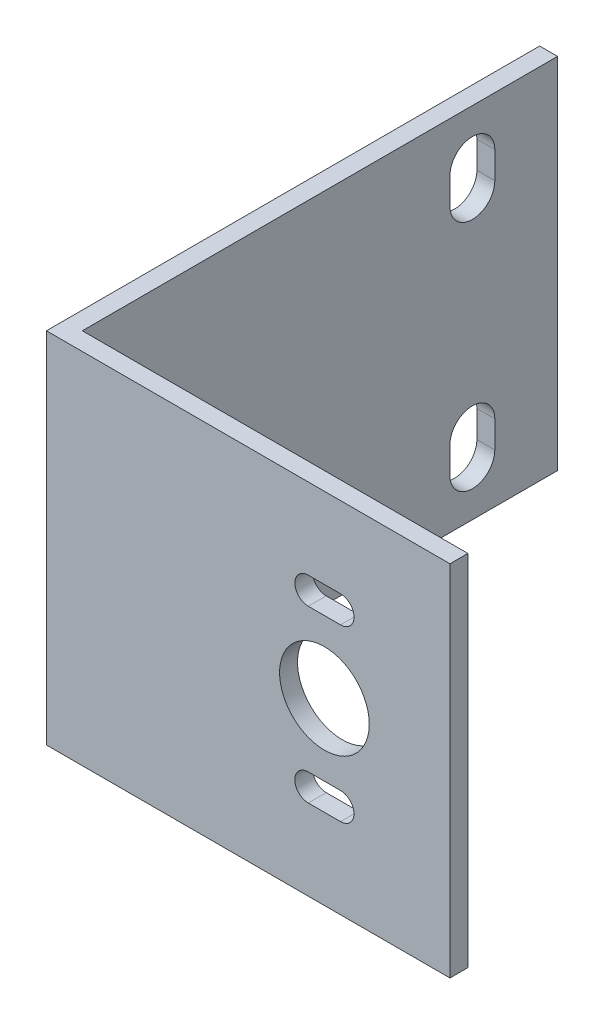
ISO-10303-21;
HEADER;
FILE_DESCRIPTION(('STEP AP214'),'2;1');
FILE_NAME('part.step','',(''),(''),'','','');
FILE_SCHEMA(('AUTOMOTIVE_DESIGN { 1 0 10303 214 1 1 1 1 }'));
ENDSEC;
DATA;
#1=APPLICATION_CONTEXT('core data for automotive mechanical design processes');
#2=APPLICATION_PROTOCOL_DEFINITION('international standard','automotive_design',2000,#1);
#3=PRODUCT_CONTEXT('',#1,'mechanical');
#4=PRODUCT('Part','Part','',(#3));
#5=PRODUCT_RELATED_PRODUCT_CATEGORY('part','',(#4));
#6=PRODUCT_DEFINITION_FORMATION('','',#4);
#7=PRODUCT_DEFINITION_CONTEXT('part definition',#1,'design');
#8=PRODUCT_DEFINITION('design','',#6,#7);
#9=PRODUCT_DEFINITION_SHAPE('','',#8);
#10=(LENGTH_UNIT() NAMED_UNIT(*) SI_UNIT(.MILLI.,.METRE.));
#11=(NAMED_UNIT(*) PLANE_ANGLE_UNIT() SI_UNIT($,.RADIAN.));
#12=(NAMED_UNIT(*) SI_UNIT($,.STERADIAN.) SOLID_ANGLE_UNIT());
#13=UNCERTAINTY_MEASURE_WITH_UNIT(LENGTH_MEASURE(1.E-05),#10,'distance_accuracy_value','');
#14=(GEOMETRIC_REPRESENTATION_CONTEXT(3) GLOBAL_UNCERTAINTY_ASSIGNED_CONTEXT((#13)) GLOBAL_UNIT_ASSIGNED_CONTEXT((#10,
#11,#12)) REPRESENTATION_CONTEXT('',''));
#15=CARTESIAN_POINT('',(0.,0.,0.));
#16=DIRECTION('',(0.,0.,1.));
#17=DIRECTION('',(1.,0.,0.));
#18=AXIS2_PLACEMENT_3D('',#15,#16,#17);
#19=CARTESIAN_POINT('',(0.,0.,2.));
#20=DIRECTION('',(0.,0.,1.));
#21=DIRECTION('',(1.,0.,0.));
#22=AXIS2_PLACEMENT_3D('',#19,#20,#21);
#23=PLANE('',#22);
#24=DIRECTION('',(1.,0.,0.));
#25=VECTOR('',#24,1.);
#26=CARTESIAN_POINT('',(36.1579650546138,10.6803278688525,2.));
#27=LINE('',#26,#25);
#28=CARTESIAN_POINT('',(36.1579650546138,10.6803278688525,2.));
#29=VERTEX_POINT('',#28);
#30=CARTESIAN_POINT('',(39.7579650546138,10.6803278688525,2.));
#31=VERTEX_POINT('',#30);
#32=EDGE_CURVE('E364',#29,#31,#27,.T.);
#33=ORIENTED_EDGE('',*,*,#32,.F.);
#34=CARTESIAN_POINT('',(36.1579650546138,12.1803278688525,2.));
#35=DIRECTION('',(0.,0.,1.));
#36=DIRECTION('',(1.,0.,0.));
#37=AXIS2_PLACEMENT_3D('',#34,#35,#36);
#38=CIRCLE('',#37,1.49999999999999);
#39=CARTESIAN_POINT('',(36.1579650546138,13.6803278688525,2.));
#40=VERTEX_POINT('',#39);
#41=EDGE_CURVE('E361',#40,#29,#38,.T.);
#42=ORIENTED_EDGE('',*,*,#41,.F.);
#43=DIRECTION('',(-1.,0.,0.));
#44=VECTOR('',#43,1.);
#45=CARTESIAN_POINT('',(36.1579650546138,13.6803278688525,2.));
#46=LINE('',#45,#44);
#47=CARTESIAN_POINT('',(39.7579650546138,13.6803278688525,2.));
#48=VERTEX_POINT('',#47);
#49=EDGE_CURVE('E372',#48,#40,#46,.T.);
#50=ORIENTED_EDGE('',*,*,#49,.F.);
#51=CARTESIAN_POINT('',(39.7579650546138,12.1803278688525,2.));
#52=DIRECTION('',(0.,0.,1.));
#53=DIRECTION('',(1.,0.,0.));
#54=AXIS2_PLACEMENT_3D('',#51,#52,#53);
#55=CIRCLE('',#54,1.5);
#56=EDGE_CURVE('E368',#31,#48,#55,.T.);
#57=ORIENTED_EDGE('',*,*,#56,.F.);
#58=EDGE_LOOP('',(#33,#42,#50,#57));
#59=FACE_BOUND('',#58,.T.);
#60=DIRECTION('',(1.,0.,0.));
#61=VECTOR('',#60,1.);
#62=CARTESIAN_POINT('',(51.9579650546138,-17.3196721311475,2.));
#63=LINE('',#62,#61);
#64=CARTESIAN_POINT('',(6.9579650546138,-17.3196721311475,2.));
#65=VERTEX_POINT('',#64);
#66=CARTESIAN_POINT('',(51.9579650546138,-17.3196721311475,2.));
#67=VERTEX_POINT('',#66);
#68=EDGE_CURVE('E404',#65,#67,#63,.T.);
#69=ORIENTED_EDGE('',*,*,#68,.T.);
#70=DIRECTION('',(0.,1.,0.));
#71=VECTOR('',#70,1.);
#72=CARTESIAN_POINT('',(51.9579650546138,22.6803278688525,2.));
#73=LINE('',#72,#71);
#74=CARTESIAN_POINT('',(51.9579650546138,22.6803278688525,2.));
#75=VERTEX_POINT('',#74);
#76=EDGE_CURVE('E408',#67,#75,#73,.T.);
#77=ORIENTED_EDGE('',*,*,#76,.T.);
#78=DIRECTION('',(-1.,0.,0.));
#79=VECTOR('',#78,1.);
#80=CARTESIAN_POINT('',(51.9579650546138,22.6803278688525,2.));
#81=LINE('',#80,#79);
#82=CARTESIAN_POINT('',(6.95796505461379,22.6803278688525,2.));
#83=VERTEX_POINT('',#82);
#84=EDGE_CURVE('E412',#75,#83,#81,.T.);
#85=ORIENTED_EDGE('',*,*,#84,.T.);
#86=DIRECTION('',(0.,-1.,0.));
#87=VECTOR('',#86,1.);
#88=CARTESIAN_POINT('',(6.95796505461379,22.6803278688525,2.));
#89=LINE('',#88,#87);
#90=EDGE_CURVE('E415',#83,#65,#89,.T.);
#91=ORIENTED_EDGE('',*,*,#90,.T.);
#92=EDGE_LOOP('',(#69,#77,#85,#91));
#93=FACE_BOUND('',#92,.T.);
#94=CARTESIAN_POINT('',(37.9579650546138,2.68032786885247,2.));
#95=DIRECTION('',(0.,0.,1.));
#96=DIRECTION('',(1.,0.,0.));
#97=AXIS2_PLACEMENT_3D('',#94,#95,#96);
#98=CIRCLE('',#97,5.);
#99=CARTESIAN_POINT('',(42.9579650546138,2.68032786885247,2.));
#100=VERTEX_POINT('',#99);
#101=EDGE_CURVE('E353',#100,#100,#98,.T.);
#102=ORIENTED_EDGE('',*,*,#101,.F.);
#103=EDGE_LOOP('',(#102));
#104=FACE_BOUND('',#103,.T.);
#105=DIRECTION('',(1.,0.,0.));
#106=VECTOR('',#105,1.);
#107=CARTESIAN_POINT('',(36.1579650546138,-8.31967213114753,2.));
#108=LINE('',#107,#106);
#109=CARTESIAN_POINT('',(36.1579650546138,-8.31967213114753,2.));
#110=VERTEX_POINT('',#109);
#111=CARTESIAN_POINT('',(39.7579650546138,-8.31967213114752,2.));
#112=VERTEX_POINT('',#111);
#113=EDGE_CURVE('E313',#110,#112,#108,.T.);
#114=ORIENTED_EDGE('',*,*,#113,.F.);
#115=CARTESIAN_POINT('',(36.1579650546138,-6.81967213114753,2.));
#116=DIRECTION('',(0.,0.,1.));
#117=DIRECTION('',(-1.,0.,0.));
#118=AXIS2_PLACEMENT_3D('',#115,#116,#117);
#119=CIRCLE('',#118,1.5);
#120=CARTESIAN_POINT('',(36.1579650546138,-5.31967213114753,2.));
#121=VERTEX_POINT('',#120);
#122=EDGE_CURVE('E310',#121,#110,#119,.T.);
#123=ORIENTED_EDGE('',*,*,#122,.F.);
#124=DIRECTION('',(-1.,0.,0.));
#125=VECTOR('',#124,1.);
#126=CARTESIAN_POINT('',(36.1579650546138,-5.31967213114753,2.));
#127=LINE('',#126,#125);
#128=CARTESIAN_POINT('',(39.7579650546138,-5.31967213114752,2.));
#129=VERTEX_POINT('',#128);
#130=EDGE_CURVE('E321',#129,#121,#127,.T.);
#131=ORIENTED_EDGE('',*,*,#130,.F.);
#132=CARTESIAN_POINT('',(39.7579650546138,-6.81967213114752,2.));
#133=DIRECTION('',(0.,0.,1.));
#134=DIRECTION('',(-1.,0.,0.));
#135=AXIS2_PLACEMENT_3D('',#132,#133,#134);
#136=CIRCLE('',#135,1.5);
#137=EDGE_CURVE('E317',#112,#129,#136,.T.);
#138=ORIENTED_EDGE('',*,*,#137,.F.);
#139=EDGE_LOOP('',(#114,#123,#131,#138));
#140=FACE_BOUND('',#139,.T.);
#141=ADVANCED_FACE('F39',(#59,#93,#104,#140),#23,.T.);
#142=CARTESIAN_POINT('',(0.,0.,0.));
#143=DIRECTION('',(0.,0.,1.));
#144=DIRECTION('',(1.,0.,0.));
#145=AXIS2_PLACEMENT_3D('',#142,#143,#144);
#146=PLANE('',#145);
#147=CARTESIAN_POINT('',(37.9579650546138,2.68032786885247,0.));
#148=DIRECTION('',(0.,0.,1.));
#149=DIRECTION('',(1.,0.,0.));
#150=AXIS2_PLACEMENT_3D('',#147,#148,#149);
#151=CIRCLE('',#150,5.);
#152=CARTESIAN_POINT('',(42.9579650546138,2.68032786885247,0.));
#153=VERTEX_POINT('',#152);
#154=EDGE_CURVE('E352',#153,#153,#151,.T.);
#155=ORIENTED_EDGE('',*,*,#154,.T.);
#156=EDGE_LOOP('',(#155));
#157=FACE_BOUND('',#156,.T.);
#158=CARTESIAN_POINT('',(36.1579650546138,12.1803278688525,0.));
#159=DIRECTION('',(0.,0.,1.));
#160=DIRECTION('',(1.,0.,0.));
#161=AXIS2_PLACEMENT_3D('',#158,#159,#160);
#162=CIRCLE('',#161,1.49999999999999);
#163=CARTESIAN_POINT('',(36.1579650546138,13.6803278688525,0.));
#164=VERTEX_POINT('',#163);
#165=CARTESIAN_POINT('',(36.1579650546138,10.6803278688525,0.));
#166=VERTEX_POINT('',#165);
#167=EDGE_CURVE('E357',#164,#166,#162,.T.);
#168=ORIENTED_EDGE('',*,*,#167,.T.);
#169=DIRECTION('',(1.,0.,0.));
#170=VECTOR('',#169,1.);
#171=CARTESIAN_POINT('',(36.1579650546138,10.6803278688525,0.));
#172=LINE('',#171,#170);
#173=CARTESIAN_POINT('',(39.7579650546138,10.6803278688525,0.));
#174=VERTEX_POINT('',#173);
#175=EDGE_CURVE('E379',#166,#174,#172,.T.);
#176=ORIENTED_EDGE('',*,*,#175,.T.);
#177=CARTESIAN_POINT('',(39.7579650546138,12.1803278688525,0.));
#178=DIRECTION('',(0.,0.,1.));
#179=DIRECTION('',(1.,0.,0.));
#180=AXIS2_PLACEMENT_3D('',#177,#178,#179);
#181=CIRCLE('',#180,1.5);
#182=CARTESIAN_POINT('',(39.7579650546138,13.6803278688525,0.));
#183=VERTEX_POINT('',#182);
#184=EDGE_CURVE('E383',#174,#183,#181,.T.);
#185=ORIENTED_EDGE('',*,*,#184,.T.);
#186=DIRECTION('',(-1.,0.,0.));
#187=VECTOR('',#186,1.);
#188=CARTESIAN_POINT('',(36.1579650546138,13.6803278688525,0.));
#189=LINE('',#188,#187);
#190=EDGE_CURVE('E365',#183,#164,#189,.T.);
#191=ORIENTED_EDGE('',*,*,#190,.T.);
#192=EDGE_LOOP('',(#168,#176,#185,#191));
#193=FACE_BOUND('',#192,.T.);
#194=DIRECTION('',(1.,0.,0.));
#195=VECTOR('',#194,1.);
#196=CARTESIAN_POINT('',(51.9579650546138,-17.3196721311475,0.));
#197=LINE('',#196,#195);
#198=CARTESIAN_POINT('',(8.95796505461379,-17.3196721311476,0.));
#199=VERTEX_POINT('',#198);
#200=CARTESIAN_POINT('',(51.9579650546138,-17.3196721311475,0.));
#201=VERTEX_POINT('',#200);
#202=EDGE_CURVE('E403',#199,#201,#197,.T.);
#203=ORIENTED_EDGE('',*,*,#202,.F.);
#204=DIRECTION('',(0.,1.,0.));
#205=VECTOR('',#204,1.);
#206=CARTESIAN_POINT('',(8.95796505461379,-17.3196721311476,0.));
#207=LINE('',#206,#205);
#208=CARTESIAN_POINT('',(8.95796505461381,22.6803278688525,0.));
#209=VERTEX_POINT('',#208);
#210=EDGE_CURVE('E292',#199,#209,#207,.T.);
#211=ORIENTED_EDGE('',*,*,#210,.T.);
#212=DIRECTION('',(-1.,0.,0.));
#213=VECTOR('',#212,1.);
#214=CARTESIAN_POINT('',(51.9579650546138,22.6803278688525,0.));
#215=LINE('',#214,#213);
#216=CARTESIAN_POINT('',(51.9579650546138,22.6803278688525,0.));
#217=VERTEX_POINT('',#216);
#218=EDGE_CURVE('E409',#217,#209,#215,.T.);
#219=ORIENTED_EDGE('',*,*,#218,.F.);
#220=DIRECTION('',(0.,1.,0.));
#221=VECTOR('',#220,1.);
#222=CARTESIAN_POINT('',(51.9579650546138,22.6803278688525,0.));
#223=LINE('',#222,#221);
#224=EDGE_CURVE('E421',#201,#217,#223,.T.);
#225=ORIENTED_EDGE('',*,*,#224,.F.);
#226=EDGE_LOOP('',(#203,#211,#219,#225));
#227=FACE_BOUND('',#226,.T.);
#228=CARTESIAN_POINT('',(36.1579650546138,-6.81967213114753,0.));
#229=DIRECTION('',(0.,0.,1.));
#230=DIRECTION('',(-1.,0.,0.));
#231=AXIS2_PLACEMENT_3D('',#228,#229,#230);
#232=CIRCLE('',#231,1.5);
#233=CARTESIAN_POINT('',(36.1579650546138,-5.31967213114753,0.));
#234=VERTEX_POINT('',#233);
#235=CARTESIAN_POINT('',(36.1579650546138,-8.31967213114753,0.));
#236=VERTEX_POINT('',#235);
#237=EDGE_CURVE('E303',#234,#236,#232,.T.);
#238=ORIENTED_EDGE('',*,*,#237,.T.);
#239=DIRECTION('',(1.,0.,0.));
#240=VECTOR('',#239,1.);
#241=CARTESIAN_POINT('',(36.1579650546138,-8.31967213114753,0.));
#242=LINE('',#241,#240);
#243=CARTESIAN_POINT('',(39.7579650546138,-8.31967213114752,0.));
#244=VERTEX_POINT('',#243);
#245=EDGE_CURVE('E328',#236,#244,#242,.T.);
#246=ORIENTED_EDGE('',*,*,#245,.T.);
#247=CARTESIAN_POINT('',(39.7579650546138,-6.81967213114752,0.));
#248=DIRECTION('',(0.,0.,1.));
#249=DIRECTION('',(-1.,0.,0.));
#250=AXIS2_PLACEMENT_3D('',#247,#248,#249);
#251=CIRCLE('',#250,1.5);
#252=CARTESIAN_POINT('',(39.7579650546138,-5.31967213114752,0.));
#253=VERTEX_POINT('',#252);
#254=EDGE_CURVE('E332',#244,#253,#251,.T.);
#255=ORIENTED_EDGE('',*,*,#254,.T.);
#256=DIRECTION('',(-1.,0.,0.));
#257=VECTOR('',#256,1.);
#258=CARTESIAN_POINT('',(36.1579650546138,-5.31967213114753,0.));
#259=LINE('',#258,#257);
#260=EDGE_CURVE('E314',#253,#234,#259,.T.);
#261=ORIENTED_EDGE('',*,*,#260,.T.);
#262=EDGE_LOOP('',(#238,#246,#255,#261));
#263=FACE_BOUND('',#262,.T.);
#264=ADVANCED_FACE('F443',(#157,#193,#227,#263),#146,.F.);
#265=CARTESIAN_POINT('',(51.9579650546138,-17.3196721311475,2.));
#266=DIRECTION('',(0.,1.,0.));
#267=DIRECTION('',(0.,0.,1.));
#268=AXIS2_PLACEMENT_3D('',#265,#266,#267);
#269=PLANE('',#268);
#270=DIRECTION('',(0.,0.,-1.));
#271=VECTOR('',#270,1.);
#272=CARTESIAN_POINT('',(6.9579650546138,-17.3196721311475,2.));
#273=LINE('',#272,#271);
#274=CARTESIAN_POINT('',(6.95796505461379,-17.3196721311476,-53.));
#275=VERTEX_POINT('',#274);
#276=EDGE_CURVE('E418',#65,#275,#273,.T.);
#277=ORIENTED_EDGE('',*,*,#276,.T.);
#278=DIRECTION('',(-1.,0.,0.));
#279=VECTOR('',#278,1.);
#280=CARTESIAN_POINT('',(6.95796505461379,-17.3196721311476,-53.));
#281=LINE('',#280,#279);
#282=CARTESIAN_POINT('',(8.95796505461379,-17.3196721311476,-53.));
#283=VERTEX_POINT('',#282);
#284=EDGE_CURVE('E287',#283,#275,#281,.T.);
#285=ORIENTED_EDGE('',*,*,#284,.F.);
#286=DIRECTION('',(0.,0.,-1.));
#287=VECTOR('',#286,1.);
#288=CARTESIAN_POINT('',(8.95796505461379,-17.3196721311476,0.));
#289=LINE('',#288,#287);
#290=EDGE_CURVE('E283',#199,#283,#289,.T.);
#291=ORIENTED_EDGE('',*,*,#290,.F.);
#292=ORIENTED_EDGE('',*,*,#202,.T.);
#293=DIRECTION('',(0.,0.,-1.));
#294=VECTOR('',#293,1.);
#295=CARTESIAN_POINT('',(51.9579650546138,-17.3196721311475,2.));
#296=LINE('',#295,#294);
#297=EDGE_CURVE('E11',#67,#201,#296,.T.);
#298=ORIENTED_EDGE('',*,*,#297,.F.);
#299=ORIENTED_EDGE('',*,*,#68,.F.);
#300=EDGE_LOOP('',(#277,#285,#291,#292,#298,#299));
#301=FACE_BOUND('',#300,.T.);
#302=ADVANCED_FACE('F41',(#301),#269,.F.);
#303=CARTESIAN_POINT('',(51.9579650546138,22.6803278688525,2.));
#304=DIRECTION('',(-1.,0.,0.));
#305=DIRECTION('',(0.,-1.,0.));
#306=AXIS2_PLACEMENT_3D('',#303,#304,#305);
#307=PLANE('',#306);
#308=ORIENTED_EDGE('',*,*,#224,.T.);
#309=DIRECTION('',(0.,0.,-1.));
#310=VECTOR('',#309,1.);
#311=CARTESIAN_POINT('',(51.9579650546138,22.6803278688525,2.));
#312=LINE('',#311,#310);
#313=EDGE_CURVE('E48',#75,#217,#312,.T.);
#314=ORIENTED_EDGE('',*,*,#313,.F.);
#315=ORIENTED_EDGE('',*,*,#76,.F.);
#316=ORIENTED_EDGE('',*,*,#297,.T.);
#317=EDGE_LOOP('',(#308,#314,#315,#316));
#318=FACE_BOUND('',#317,.T.);
#319=ADVANCED_FACE('F461',(#318),#307,.F.);
#320=CARTESIAN_POINT('',(51.9579650546138,22.6803278688525,2.));
#321=DIRECTION('',(0.,-1.,0.));
#322=DIRECTION('',(0.,0.,-1.));
#323=AXIS2_PLACEMENT_3D('',#320,#321,#322);
#324=PLANE('',#323);
#325=ORIENTED_EDGE('',*,*,#218,.T.);
#326=DIRECTION('',(0.,0.,-1.));
#327=VECTOR('',#326,1.);
#328=CARTESIAN_POINT('',(8.95796505461379,22.6803278688525,0.));
#329=LINE('',#328,#327);
#330=CARTESIAN_POINT('',(8.95796505461379,22.6803278688525,-53.));
#331=VERTEX_POINT('',#330);
#332=EDGE_CURVE('E282',#209,#331,#329,.T.);
#333=ORIENTED_EDGE('',*,*,#332,.T.);
#334=DIRECTION('',(-1.,0.,0.));
#335=VECTOR('',#334,1.);
#336=CARTESIAN_POINT('',(6.95796505461379,22.6803278688525,-53.));
#337=LINE('',#336,#335);
#338=CARTESIAN_POINT('',(6.95796505461379,22.6803278688525,-53.));
#339=VERTEX_POINT('',#338);
#340=EDGE_CURVE('E288',#331,#339,#337,.T.);
#341=ORIENTED_EDGE('',*,*,#340,.T.);
#342=DIRECTION('',(0.,0.,-1.));
#343=VECTOR('',#342,1.);
#344=CARTESIAN_POINT('',(6.95796505461379,22.6803278688525,2.));
#345=LINE('',#344,#343);
#346=EDGE_CURVE('E429',#83,#339,#345,.T.);
#347=ORIENTED_EDGE('',*,*,#346,.F.);
#348=ORIENTED_EDGE('',*,*,#84,.F.);
#349=ORIENTED_EDGE('',*,*,#313,.T.);
#350=EDGE_LOOP('',(#325,#333,#341,#347,#348,#349));
#351=FACE_BOUND('',#350,.T.);
#352=ADVANCED_FACE('F437',(#351),#324,.F.);
#353=CARTESIAN_POINT('',(6.95796505461379,22.6803278688525,2.));
#354=DIRECTION('',(1.,0.,0.));
#355=DIRECTION('',(0.,1.,0.));
#356=AXIS2_PLACEMENT_3D('',#353,#354,#355);
#357=PLANE('',#356);
#358=DIRECTION('',(0.,-1.,0.));
#359=VECTOR('',#358,1.);
#360=CARTESIAN_POINT('',(6.95796505461379,22.6803278688525,-41.));
#361=LINE('',#360,#359);
#362=CARTESIAN_POINT('',(6.9579650546138,-8.81967213114756,-41.));
#363=VERTEX_POINT('',#362);
#364=CARTESIAN_POINT('',(6.9579650546138,-11.8196721311476,-41.));
#365=VERTEX_POINT('',#364);
#366=EDGE_CURVE('E274',#363,#365,#361,.T.);
#367=ORIENTED_EDGE('',*,*,#366,.T.);
#368=CARTESIAN_POINT('',(6.9579650546138,-11.8196721311476,-43.5));
#369=DIRECTION('',(1.,0.,0.));
#370=DIRECTION('',(0.,1.,0.));
#371=AXIS2_PLACEMENT_3D('',#368,#369,#370);
#372=CIRCLE('',#371,2.5);
#373=CARTESIAN_POINT('',(6.9579650546138,-11.8196721311476,-46.));
#374=VERTEX_POINT('',#373);
#375=EDGE_CURVE('E278',#365,#374,#372,.T.);
#376=ORIENTED_EDGE('',*,*,#375,.T.);
#377=DIRECTION('',(0.,1.,0.));
#378=VECTOR('',#377,1.);
#379=CARTESIAN_POINT('',(6.95796505461379,22.6803278688525,-46.));
#380=LINE('',#379,#378);
#381=CARTESIAN_POINT('',(6.9579650546138,-8.81967213114756,-46.));
#382=VERTEX_POINT('',#381);
#383=EDGE_CURVE('E269',#374,#382,#380,.T.);
#384=ORIENTED_EDGE('',*,*,#383,.T.);
#385=CARTESIAN_POINT('',(6.9579650546138,-8.81967213114756,-43.5));
#386=DIRECTION('',(1.,0.,0.));
#387=DIRECTION('',(0.,1.,0.));
#388=AXIS2_PLACEMENT_3D('',#385,#386,#387);
#389=CIRCLE('',#388,2.5);
#390=EDGE_CURVE('E194',#382,#363,#389,.T.);
#391=ORIENTED_EDGE('',*,*,#390,.T.);
#392=EDGE_LOOP('',(#367,#376,#384,#391));
#393=FACE_BOUND('',#392,.T.);
#394=DIRECTION('',(0.,1.,0.));
#395=VECTOR('',#394,1.);
#396=CARTESIAN_POINT('',(6.95796505461379,22.6803278688525,-46.));
#397=LINE('',#396,#395);
#398=CARTESIAN_POINT('',(6.95796505461379,14.1803278688525,-46.));
#399=VERTEX_POINT('',#398);
#400=CARTESIAN_POINT('',(6.95796505461379,17.1803278688525,-46.));
#401=VERTEX_POINT('',#400);
#402=EDGE_CURVE('E261',#399,#401,#397,.T.);
#403=ORIENTED_EDGE('',*,*,#402,.T.);
#404=CARTESIAN_POINT('',(6.95796505461379,17.1803278688525,-43.5));
#405=DIRECTION('',(1.,0.,0.));
#406=DIRECTION('',(0.,1.,0.));
#407=AXIS2_PLACEMENT_3D('',#404,#405,#406);
#408=CIRCLE('',#407,2.5);
#409=CARTESIAN_POINT('',(6.95796505461379,17.1803278688525,-41.));
#410=VERTEX_POINT('',#409);
#411=EDGE_CURVE('E265',#401,#410,#408,.T.);
#412=ORIENTED_EDGE('',*,*,#411,.T.);
#413=DIRECTION('',(0.,-1.,0.));
#414=VECTOR('',#413,1.);
#415=CARTESIAN_POINT('',(6.95796505461379,22.6803278688525,-41.));
#416=LINE('',#415,#414);
#417=CARTESIAN_POINT('',(6.95796505461379,14.1803278688525,-41.));
#418=VERTEX_POINT('',#417);
#419=EDGE_CURVE('E223',#410,#418,#416,.T.);
#420=ORIENTED_EDGE('',*,*,#419,.T.);
#421=CARTESIAN_POINT('',(6.95796505461379,14.1803278688525,-43.5));
#422=DIRECTION('',(1.,0.,0.));
#423=DIRECTION('',(0.,1.,0.));
#424=AXIS2_PLACEMENT_3D('',#421,#422,#423);
#425=CIRCLE('',#424,2.5);
#426=EDGE_CURVE('E257',#418,#399,#425,.T.);
#427=ORIENTED_EDGE('',*,*,#426,.T.);
#428=EDGE_LOOP('',(#403,#412,#420,#427));
#429=FACE_BOUND('',#428,.T.);
#430=ORIENTED_EDGE('',*,*,#346,.T.);
#431=DIRECTION('',(0.,1.,0.));
#432=VECTOR('',#431,1.);
#433=CARTESIAN_POINT('',(6.95796505461379,-17.3196721311476,-53.));
#434=LINE('',#433,#432);
#435=EDGE_CURVE('E299',#275,#339,#434,.T.);
#436=ORIENTED_EDGE('',*,*,#435,.F.);
#437=ORIENTED_EDGE('',*,*,#276,.F.);
#438=ORIENTED_EDGE('',*,*,#90,.F.);
#439=EDGE_LOOP('',(#430,#436,#437,#438));
#440=FACE_BOUND('',#439,.T.);
#441=ADVANCED_FACE('F458',(#393,#429,#440),#357,.F.);
#442=CARTESIAN_POINT('',(36.1579650546138,12.1803278688525,2.));
#443=DIRECTION('',(0.,0.,-1.));
#444=DIRECTION('',(-1.,0.,0.));
#445=AXIS2_PLACEMENT_3D('',#442,#443,#444);
#446=CYLINDRICAL_SURFACE('',#445,1.49999999999999);
#447=ORIENTED_EDGE('',*,*,#167,.F.);
#448=DIRECTION('',(0.,0.,-1.));
#449=VECTOR('',#448,1.);
#450=CARTESIAN_POINT('',(36.1579650546138,13.6803278688525,2.));
#451=LINE('',#450,#449);
#452=EDGE_CURVE('E375',#40,#164,#451,.T.);
#453=ORIENTED_EDGE('',*,*,#452,.F.);
#454=ORIENTED_EDGE('',*,*,#41,.T.);
#455=DIRECTION('',(0.,0.,-1.));
#456=VECTOR('',#455,1.);
#457=CARTESIAN_POINT('',(36.1579650546138,10.6803278688525,2.));
#458=LINE('',#457,#456);
#459=EDGE_CURVE('E399',#29,#166,#458,.T.);
#460=ORIENTED_EDGE('',*,*,#459,.T.);
#461=EDGE_LOOP('',(#447,#453,#454,#460));
#462=FACE_BOUND('',#461,.T.);
#463=ADVANCED_FACE('F478',(#462),#446,.F.);
#464=CARTESIAN_POINT('',(36.1579650546138,10.6803278688525,2.));
#465=DIRECTION('',(0.,1.,0.));
#466=DIRECTION('',(-1.,0.,0.));
#467=AXIS2_PLACEMENT_3D('',#464,#465,#466);
#468=PLANE('',#467);
#469=ORIENTED_EDGE('',*,*,#175,.F.);
#470=ORIENTED_EDGE('',*,*,#459,.F.);
#471=ORIENTED_EDGE('',*,*,#32,.T.);
#472=DIRECTION('',(0.,0.,-1.));
#473=VECTOR('',#472,1.);
#474=CARTESIAN_POINT('',(39.7579650546138,10.6803278688525,2.));
#475=LINE('',#474,#473);
#476=EDGE_CURVE('E396',#31,#174,#475,.T.);
#477=ORIENTED_EDGE('',*,*,#476,.T.);
#478=EDGE_LOOP('',(#469,#470,#471,#477));
#479=FACE_BOUND('',#478,.T.);
#480=ADVANCED_FACE('F486',(#479),#468,.T.);
#481=CARTESIAN_POINT('',(39.7579650546138,12.1803278688525,2.));
#482=DIRECTION('',(0.,0.,-1.));
#483=DIRECTION('',(-1.,0.,0.));
#484=AXIS2_PLACEMENT_3D('',#481,#482,#483);
#485=CYLINDRICAL_SURFACE('',#484,1.5);
#486=ORIENTED_EDGE('',*,*,#184,.F.);
#487=ORIENTED_EDGE('',*,*,#476,.F.);
#488=ORIENTED_EDGE('',*,*,#56,.T.);
#489=DIRECTION('',(0.,0.,-1.));
#490=VECTOR('',#489,1.);
#491=CARTESIAN_POINT('',(39.7579650546138,13.6803278688525,2.));
#492=LINE('',#491,#490);
#493=EDGE_CURVE('E393',#48,#183,#492,.T.);
#494=ORIENTED_EDGE('',*,*,#493,.T.);
#495=EDGE_LOOP('',(#486,#487,#488,#494));
#496=FACE_BOUND('',#495,.T.);
#497=ADVANCED_FACE('F545',(#496),#485,.F.);
#498=CARTESIAN_POINT('',(36.1579650546138,13.6803278688525,2.));
#499=DIRECTION('',(0.,-1.,0.));
#500=DIRECTION('',(1.,0.,0.));
#501=AXIS2_PLACEMENT_3D('',#498,#499,#500);
#502=PLANE('',#501);
#503=ORIENTED_EDGE('',*,*,#190,.F.);
#504=ORIENTED_EDGE('',*,*,#493,.F.);
#505=ORIENTED_EDGE('',*,*,#49,.T.);
#506=ORIENTED_EDGE('',*,*,#452,.T.);
#507=EDGE_LOOP('',(#503,#504,#505,#506));
#508=FACE_BOUND('',#507,.T.);
#509=ADVANCED_FACE('F541',(#508),#502,.T.);
#510=CARTESIAN_POINT('',(37.9579650546138,2.68032786885247,2.));
#511=DIRECTION('',(0.,0.,-1.));
#512=DIRECTION('',(-1.,0.,0.));
#513=AXIS2_PLACEMENT_3D('',#510,#511,#512);
#514=CYLINDRICAL_SURFACE('',#513,5.);
#515=ORIENTED_EDGE('',*,*,#101,.T.);
#516=EDGE_LOOP('',(#515));
#517=FACE_BOUND('',#516,.T.);
#518=ORIENTED_EDGE('',*,*,#154,.F.);
#519=EDGE_LOOP('',(#518));
#520=FACE_BOUND('',#519,.T.);
#521=ADVANCED_FACE('F537',(#517,#520),#514,.F.);
#522=CARTESIAN_POINT('',(36.1579650546138,-6.81967213114753,2.));
#523=DIRECTION('',(0.,0.,-1.));
#524=DIRECTION('',(-1.,0.,0.));
#525=AXIS2_PLACEMENT_3D('',#522,#523,#524);
#526=CYLINDRICAL_SURFACE('',#525,1.5);
#527=ORIENTED_EDGE('',*,*,#237,.F.);
#528=DIRECTION('',(0.,0.,-1.));
#529=VECTOR('',#528,1.);
#530=CARTESIAN_POINT('',(36.1579650546138,-5.31967213114753,2.));
#531=LINE('',#530,#529);
#532=EDGE_CURVE('E324',#121,#234,#531,.T.);
#533=ORIENTED_EDGE('',*,*,#532,.F.);
#534=ORIENTED_EDGE('',*,*,#122,.T.);
#535=DIRECTION('',(0.,0.,-1.));
#536=VECTOR('',#535,1.);
#537=CARTESIAN_POINT('',(36.1579650546138,-8.31967213114753,2.));
#538=LINE('',#537,#536);
#539=EDGE_CURVE('E348',#110,#236,#538,.T.);
#540=ORIENTED_EDGE('',*,*,#539,.T.);
#541=EDGE_LOOP('',(#527,#533,#534,#540));
#542=FACE_BOUND('',#541,.T.);
#543=ADVANCED_FACE('F533',(#542),#526,.F.);
#544=CARTESIAN_POINT('',(36.1579650546138,-8.31967213114753,2.));
#545=DIRECTION('',(0.,1.,0.));
#546=DIRECTION('',(-1.,0.,0.));
#547=AXIS2_PLACEMENT_3D('',#544,#545,#546);
#548=PLANE('',#547);
#549=ORIENTED_EDGE('',*,*,#245,.F.);
#550=ORIENTED_EDGE('',*,*,#539,.F.);
#551=ORIENTED_EDGE('',*,*,#113,.T.);
#552=DIRECTION('',(0.,0.,-1.));
#553=VECTOR('',#552,1.);
#554=CARTESIAN_POINT('',(39.7579650546138,-8.31967213114752,2.));
#555=LINE('',#554,#553);
#556=EDGE_CURVE('E345',#112,#244,#555,.T.);
#557=ORIENTED_EDGE('',*,*,#556,.T.);
#558=EDGE_LOOP('',(#549,#550,#551,#557));
#559=FACE_BOUND('',#558,.T.);
#560=ADVANCED_FACE('F529',(#559),#548,.T.);
#561=CARTESIAN_POINT('',(39.7579650546138,-6.81967213114752,2.));
#562=DIRECTION('',(0.,0.,-1.));
#563=DIRECTION('',(-1.,0.,0.));
#564=AXIS2_PLACEMENT_3D('',#561,#562,#563);
#565=CYLINDRICAL_SURFACE('',#564,1.5);
#566=ORIENTED_EDGE('',*,*,#254,.F.);
#567=ORIENTED_EDGE('',*,*,#556,.F.);
#568=ORIENTED_EDGE('',*,*,#137,.T.);
#569=DIRECTION('',(0.,0.,-1.));
#570=VECTOR('',#569,1.);
#571=CARTESIAN_POINT('',(39.7579650546138,-5.31967213114752,2.));
#572=LINE('',#571,#570);
#573=EDGE_CURVE('E342',#129,#253,#572,.T.);
#574=ORIENTED_EDGE('',*,*,#573,.T.);
#575=EDGE_LOOP('',(#566,#567,#568,#574));
#576=FACE_BOUND('',#575,.T.);
#577=ADVANCED_FACE('F525',(#576),#565,.F.);
#578=CARTESIAN_POINT('',(36.1579650546138,-5.31967213114753,2.));
#579=DIRECTION('',(0.,-1.,0.));
#580=DIRECTION('',(1.,0.,0.));
#581=AXIS2_PLACEMENT_3D('',#578,#579,#580);
#582=PLANE('',#581);
#583=ORIENTED_EDGE('',*,*,#260,.F.);
#584=ORIENTED_EDGE('',*,*,#573,.F.);
#585=ORIENTED_EDGE('',*,*,#130,.T.);
#586=ORIENTED_EDGE('',*,*,#532,.T.);
#587=EDGE_LOOP('',(#583,#584,#585,#586));
#588=FACE_BOUND('',#587,.T.);
#589=ADVANCED_FACE('F520',(#588),#582,.T.);
#590=CARTESIAN_POINT('',(6.95796505461379,-17.3196721311476,-53.));
#591=DIRECTION('',(0.,0.,-1.));
#592=DIRECTION('',(-1.,0.,0.));
#593=AXIS2_PLACEMENT_3D('',#590,#591,#592);
#594=PLANE('',#593);
#595=ORIENTED_EDGE('',*,*,#340,.F.);
#596=DIRECTION('',(0.,1.,0.));
#597=VECTOR('',#596,1.);
#598=CARTESIAN_POINT('',(8.95796505461379,-17.3196721311476,-53.));
#599=LINE('',#598,#597);
#600=EDGE_CURVE('E304',#283,#331,#599,.T.);
#601=ORIENTED_EDGE('',*,*,#600,.F.);
#602=ORIENTED_EDGE('',*,*,#284,.T.);
#603=ORIENTED_EDGE('',*,*,#435,.T.);
#604=EDGE_LOOP('',(#595,#601,#602,#603));
#605=FACE_BOUND('',#604,.T.);
#606=ADVANCED_FACE('F455',(#605),#594,.T.);
#607=CARTESIAN_POINT('',(8.95796505461379,-17.3196721311476,0.));
#608=DIRECTION('',(1.,0.,0.));
#609=DIRECTION('',(0.,0.,-1.));
#610=AXIS2_PLACEMENT_3D('',#607,#608,#609);
#611=PLANE('',#610);
#612=CARTESIAN_POINT('',(8.95796505461379,-11.8196721311476,-43.5));
#613=DIRECTION('',(1.,0.,0.));
#614=DIRECTION('',(0.,0.,-1.));
#615=AXIS2_PLACEMENT_3D('',#612,#613,#614);
#616=CIRCLE('',#615,2.5);
#617=CARTESIAN_POINT('',(8.95796505461379,-11.8196721311476,-41.));
#618=VERTEX_POINT('',#617);
#619=CARTESIAN_POINT('',(8.95796505461379,-11.8196721311476,-46.));
#620=VERTEX_POINT('',#619);
#621=EDGE_CURVE('E208',#618,#620,#616,.T.);
#622=ORIENTED_EDGE('',*,*,#621,.F.);
#623=DIRECTION('',(0.,-1.,0.));
#624=VECTOR('',#623,1.);
#625=CARTESIAN_POINT('',(8.95796505461379,-11.8196721311476,-41.));
#626=LINE('',#625,#624);
#627=CARTESIAN_POINT('',(8.95796505461379,-8.81967213114756,-41.));
#628=VERTEX_POINT('',#627);
#629=EDGE_CURVE('E213',#628,#618,#626,.T.);
#630=ORIENTED_EDGE('',*,*,#629,.F.);
#631=CARTESIAN_POINT('',(8.95796505461379,-8.81967213114756,-43.5));
#632=DIRECTION('',(1.,0.,0.));
#633=DIRECTION('',(0.,0.,-1.));
#634=AXIS2_PLACEMENT_3D('',#631,#632,#633);
#635=CIRCLE('',#634,2.5);
#636=CARTESIAN_POINT('',(8.95796505461379,-8.81967213114756,-46.));
#637=VERTEX_POINT('',#636);
#638=EDGE_CURVE('E191',#637,#628,#635,.T.);
#639=ORIENTED_EDGE('',*,*,#638,.F.);
#640=DIRECTION('',(0.,1.,0.));
#641=VECTOR('',#640,1.);
#642=CARTESIAN_POINT('',(8.95796505461379,-11.8196721311476,-46.));
#643=LINE('',#642,#641);
#644=EDGE_CURVE('E202',#620,#637,#643,.T.);
#645=ORIENTED_EDGE('',*,*,#644,.F.);
#646=EDGE_LOOP('',(#622,#630,#639,#645));
#647=FACE_BOUND('',#646,.T.);
#648=CARTESIAN_POINT('',(8.95796505461379,17.1803278688525,-43.5));
#649=DIRECTION('',(1.,0.,0.));
#650=DIRECTION('',(0.,0.,1.));
#651=AXIS2_PLACEMENT_3D('',#648,#649,#650);
#652=CIRCLE('',#651,2.5);
#653=CARTESIAN_POINT('',(8.95796505461379,17.1803278688525,-46.));
#654=VERTEX_POINT('',#653);
#655=CARTESIAN_POINT('',(8.95796505461379,17.1803278688525,-41.));
#656=VERTEX_POINT('',#655);
#657=EDGE_CURVE('E228',#654,#656,#652,.T.);
#658=ORIENTED_EDGE('',*,*,#657,.F.);
#659=DIRECTION('',(0.,1.,0.));
#660=VECTOR('',#659,1.);
#661=CARTESIAN_POINT('',(8.95796505461379,17.1803278688525,-46.));
#662=LINE('',#661,#660);
#663=CARTESIAN_POINT('',(8.95796505461379,14.1803278688525,-46.));
#664=VERTEX_POINT('',#663);
#665=EDGE_CURVE('E238',#664,#654,#662,.T.);
#666=ORIENTED_EDGE('',*,*,#665,.F.);
#667=CARTESIAN_POINT('',(8.95796505461379,14.1803278688525,-43.5));
#668=DIRECTION('',(1.,0.,0.));
#669=DIRECTION('',(0.,0.,1.));
#670=AXIS2_PLACEMENT_3D('',#667,#668,#669);
#671=CIRCLE('',#670,2.5);
#672=CARTESIAN_POINT('',(8.95796505461379,14.1803278688525,-41.));
#673=VERTEX_POINT('',#672);
#674=EDGE_CURVE('E234',#673,#664,#671,.T.);
#675=ORIENTED_EDGE('',*,*,#674,.F.);
#676=DIRECTION('',(0.,-1.,0.));
#677=VECTOR('',#676,1.);
#678=CARTESIAN_POINT('',(8.95796505461379,17.1803278688525,-41.));
#679=LINE('',#678,#677);
#680=EDGE_CURVE('E231',#656,#673,#679,.T.);
#681=ORIENTED_EDGE('',*,*,#680,.F.);
#682=EDGE_LOOP('',(#658,#666,#675,#681));
#683=FACE_BOUND('',#682,.T.);
#684=ORIENTED_EDGE('',*,*,#332,.F.);
#685=ORIENTED_EDGE('',*,*,#210,.F.);
#686=ORIENTED_EDGE('',*,*,#290,.T.);
#687=ORIENTED_EDGE('',*,*,#600,.T.);
#688=EDGE_LOOP('',(#684,#685,#686,#687));
#689=FACE_BOUND('',#688,.T.);
#690=ADVANCED_FACE('F210',(#647,#683,#689),#611,.T.);
#691=CARTESIAN_POINT('',(-31.0420349453862,17.1803278688525,-43.5));
#692=DIRECTION('',(1.,0.,0.));
#693=DIRECTION('',(0.,0.,-1.));
#694=AXIS2_PLACEMENT_3D('',#691,#692,#693);
#695=CYLINDRICAL_SURFACE('',#694,2.5);
#696=DIRECTION('',(1.,0.,0.));
#697=VECTOR('',#696,1.);
#698=CARTESIAN_POINT('',(-31.0420349453862,17.1803278688525,-46.));
#699=LINE('',#698,#697);
#700=EDGE_CURVE('E243',#401,#654,#699,.T.);
#701=ORIENTED_EDGE('',*,*,#700,.T.);
#702=ORIENTED_EDGE('',*,*,#657,.T.);
#703=DIRECTION('',(1.,0.,0.));
#704=VECTOR('',#703,1.);
#705=CARTESIAN_POINT('',(-31.0420349453862,17.1803278688525,-41.));
#706=LINE('',#705,#704);
#707=EDGE_CURVE('E242',#410,#656,#706,.T.);
#708=ORIENTED_EDGE('',*,*,#707,.F.);
#709=ORIENTED_EDGE('',*,*,#411,.F.);
#710=EDGE_LOOP('',(#701,#702,#708,#709));
#711=FACE_BOUND('',#710,.T.);
#712=ADVANCED_FACE('F501',(#711),#695,.F.);
#713=CARTESIAN_POINT('',(-31.0420349453862,17.1803278688525,-46.));
#714=DIRECTION('',(0.,0.,-1.));
#715=DIRECTION('',(-1.,0.,0.));
#716=AXIS2_PLACEMENT_3D('',#713,#714,#715);
#717=PLANE('',#716);
#718=DIRECTION('',(1.,0.,0.));
#719=VECTOR('',#718,1.);
#720=CARTESIAN_POINT('',(-31.0420349453862,14.1803278688525,-46.));
#721=LINE('',#720,#719);
#722=EDGE_CURVE('E246',#399,#664,#721,.T.);
#723=ORIENTED_EDGE('',*,*,#722,.T.);
#724=ORIENTED_EDGE('',*,*,#665,.T.);
#725=ORIENTED_EDGE('',*,*,#700,.F.);
#726=ORIENTED_EDGE('',*,*,#402,.F.);
#727=EDGE_LOOP('',(#723,#724,#725,#726));
#728=FACE_BOUND('',#727,.T.);
#729=ADVANCED_FACE('F492',(#728),#717,.F.);
#730=CARTESIAN_POINT('',(-31.0420349453862,14.1803278688525,-43.5));
#731=DIRECTION('',(1.,0.,0.));
#732=DIRECTION('',(0.,0.,-1.));
#733=AXIS2_PLACEMENT_3D('',#730,#731,#732);
#734=CYLINDRICAL_SURFACE('',#733,2.5);
#735=DIRECTION('',(1.,0.,0.));
#736=VECTOR('',#735,1.);
#737=CARTESIAN_POINT('',(-31.0420349453862,14.1803278688525,-41.));
#738=LINE('',#737,#736);
#739=EDGE_CURVE('E63',#418,#673,#738,.T.);
#740=ORIENTED_EDGE('',*,*,#739,.T.);
#741=ORIENTED_EDGE('',*,*,#674,.T.);
#742=ORIENTED_EDGE('',*,*,#722,.F.);
#743=ORIENTED_EDGE('',*,*,#426,.F.);
#744=EDGE_LOOP('',(#740,#741,#742,#743));
#745=FACE_BOUND('',#744,.T.);
#746=ADVANCED_FACE('F494',(#745),#734,.F.);
#747=CARTESIAN_POINT('',(-31.0420349453862,17.1803278688525,-41.));
#748=DIRECTION('',(0.,0.,1.));
#749=DIRECTION('',(1.,0.,0.));
#750=AXIS2_PLACEMENT_3D('',#747,#748,#749);
#751=PLANE('',#750);
#752=ORIENTED_EDGE('',*,*,#707,.T.);
#753=ORIENTED_EDGE('',*,*,#680,.T.);
#754=ORIENTED_EDGE('',*,*,#739,.F.);
#755=ORIENTED_EDGE('',*,*,#419,.F.);
#756=EDGE_LOOP('',(#752,#753,#754,#755));
#757=FACE_BOUND('',#756,.T.);
#758=ADVANCED_FACE('F502',(#757),#751,.F.);
#759=CARTESIAN_POINT('',(-31.0420349453862,-11.8196721311476,-43.5));
#760=DIRECTION('',(1.,0.,0.));
#761=DIRECTION('',(0.,0.,-1.));
#762=AXIS2_PLACEMENT_3D('',#759,#760,#761);
#763=CYLINDRICAL_SURFACE('',#762,2.5);
#764=DIRECTION('',(1.,0.,0.));
#765=VECTOR('',#764,1.);
#766=CARTESIAN_POINT('',(-31.0420349453862,-11.8196721311476,-41.));
#767=LINE('',#766,#765);
#768=EDGE_CURVE('E220',#365,#618,#767,.T.);
#769=ORIENTED_EDGE('',*,*,#768,.T.);
#770=ORIENTED_EDGE('',*,*,#621,.T.);
#771=DIRECTION('',(1.,0.,0.));
#772=VECTOR('',#771,1.);
#773=CARTESIAN_POINT('',(-31.0420349453862,-11.8196721311476,-46.));
#774=LINE('',#773,#772);
#775=EDGE_CURVE('E198',#374,#620,#774,.T.);
#776=ORIENTED_EDGE('',*,*,#775,.F.);
#777=ORIENTED_EDGE('',*,*,#375,.F.);
#778=EDGE_LOOP('',(#769,#770,#776,#777));
#779=FACE_BOUND('',#778,.T.);
#780=ADVANCED_FACE('F504',(#779),#763,.F.);
#781=CARTESIAN_POINT('',(-31.0420349453862,-11.8196721311476,-41.));
#782=DIRECTION('',(0.,0.,1.));
#783=DIRECTION('',(1.,0.,0.));
#784=AXIS2_PLACEMENT_3D('',#781,#782,#783);
#785=PLANE('',#784);
#786=DIRECTION('',(1.,0.,0.));
#787=VECTOR('',#786,1.);
#788=CARTESIAN_POINT('',(-31.0420349453862,-8.81967213114756,-41.));
#789=LINE('',#788,#787);
#790=EDGE_CURVE('E197',#363,#628,#789,.T.);
#791=ORIENTED_EDGE('',*,*,#790,.T.);
#792=ORIENTED_EDGE('',*,*,#629,.T.);
#793=ORIENTED_EDGE('',*,*,#768,.F.);
#794=ORIENTED_EDGE('',*,*,#366,.F.);
#795=EDGE_LOOP('',(#791,#792,#793,#794));
#796=FACE_BOUND('',#795,.T.);
#797=ADVANCED_FACE('F510',(#796),#785,.F.);
#798=CARTESIAN_POINT('',(-31.0420349453862,-8.81967213114756,-43.5));
#799=DIRECTION('',(1.,0.,0.));
#800=DIRECTION('',(0.,0.,-1.));
#801=AXIS2_PLACEMENT_3D('',#798,#799,#800);
#802=CYLINDRICAL_SURFACE('',#801,2.5);
#803=DIRECTION('',(1.,0.,0.));
#804=VECTOR('',#803,1.);
#805=CARTESIAN_POINT('',(-31.0420349453862,-8.81967213114756,-46.));
#806=LINE('',#805,#804);
#807=EDGE_CURVE('E55',#382,#637,#806,.T.);
#808=ORIENTED_EDGE('',*,*,#807,.T.);
#809=ORIENTED_EDGE('',*,*,#638,.T.);
#810=ORIENTED_EDGE('',*,*,#790,.F.);
#811=ORIENTED_EDGE('',*,*,#390,.F.);
#812=EDGE_LOOP('',(#808,#809,#810,#811));
#813=FACE_BOUND('',#812,.T.);
#814=ADVANCED_FACE('F188',(#813),#802,.F.);
#815=CARTESIAN_POINT('',(-31.0420349453862,-11.8196721311476,-46.));
#816=DIRECTION('',(0.,0.,-1.));
#817=DIRECTION('',(-1.,0.,0.));
#818=AXIS2_PLACEMENT_3D('',#815,#816,#817);
#819=PLANE('',#818);
#820=ORIENTED_EDGE('',*,*,#775,.T.);
#821=ORIENTED_EDGE('',*,*,#644,.T.);
#822=ORIENTED_EDGE('',*,*,#807,.F.);
#823=ORIENTED_EDGE('',*,*,#383,.F.);
#824=EDGE_LOOP('',(#820,#821,#822,#823));
#825=FACE_BOUND('',#824,.T.);
#826=ADVANCED_FACE('F203',(#825),#819,.F.);
#827=CLOSED_SHELL('',(#141,#264,#302,#319,#352,#441,#463,#480,#497,#509,#521,#543,#560,#577,
#589,#606,#690,#712,#729,#746,#758,#780,#797,#814,#826));
#828=MANIFOLD_SOLID_BREP('B2',#827);
#829=ADVANCED_BREP_SHAPE_REPRESENTATION('',(#18,#828),#14);
#830=SHAPE_DEFINITION_REPRESENTATION(#9,#829);
ENDSEC;
END-ISO-10303-21;
